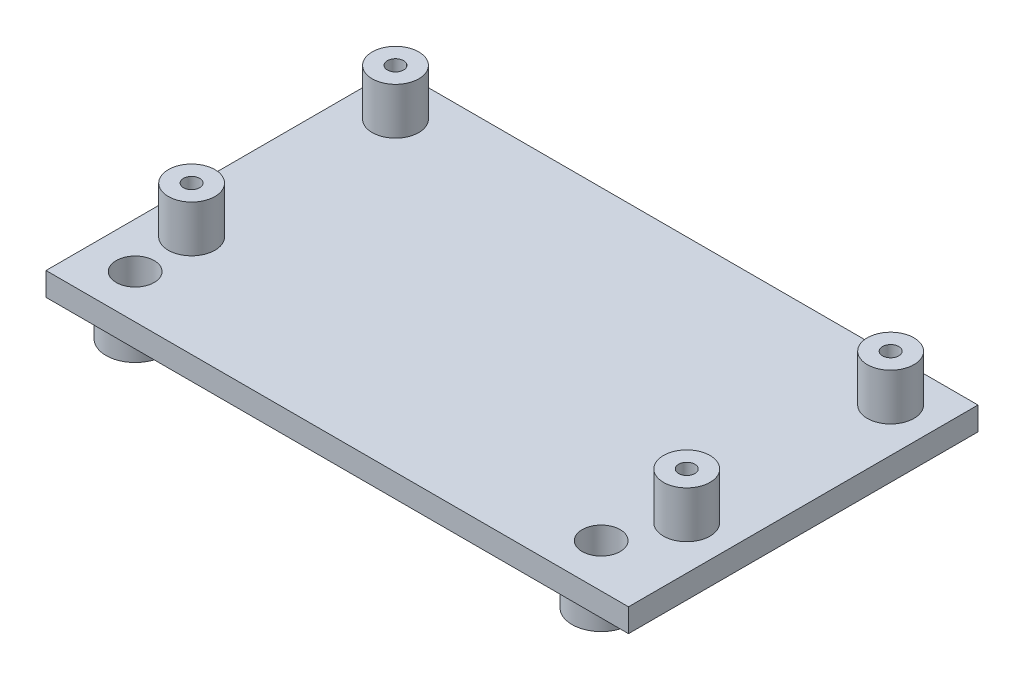
ISO-10303-21;
HEADER;
FILE_DESCRIPTION(('STEP AP214'),'2;1');
FILE_NAME('part.step','',(''),(''),'','','');
FILE_SCHEMA(('AUTOMOTIVE_DESIGN { 1 0 10303 214 1 1 1 1 }'));
ENDSEC;
DATA;
#1=APPLICATION_CONTEXT('core data for automotive mechanical design processes');
#2=APPLICATION_PROTOCOL_DEFINITION('international standard','automotive_design',2000,#1);
#3=PRODUCT_CONTEXT('',#1,'mechanical');
#4=PRODUCT('Part','Part','',(#3));
#5=PRODUCT_RELATED_PRODUCT_CATEGORY('part','',(#4));
#6=PRODUCT_DEFINITION_FORMATION('','',#4);
#7=PRODUCT_DEFINITION_CONTEXT('part definition',#1,'design');
#8=PRODUCT_DEFINITION('design','',#6,#7);
#9=PRODUCT_DEFINITION_SHAPE('','',#8);
#10=(LENGTH_UNIT() NAMED_UNIT(*) SI_UNIT(.MILLI.,.METRE.));
#11=(NAMED_UNIT(*) PLANE_ANGLE_UNIT() SI_UNIT($,.RADIAN.));
#12=(NAMED_UNIT(*) SI_UNIT($,.STERADIAN.) SOLID_ANGLE_UNIT());
#13=UNCERTAINTY_MEASURE_WITH_UNIT(LENGTH_MEASURE(1.E-05),#10,'distance_accuracy_value','');
#14=(GEOMETRIC_REPRESENTATION_CONTEXT(3) GLOBAL_UNCERTAINTY_ASSIGNED_CONTEXT((#13)) GLOBAL_UNIT_ASSIGNED_CONTEXT((#10,
#11,#12)) REPRESENTATION_CONTEXT('',''));
#15=CARTESIAN_POINT('',(0.,0.,0.));
#16=DIRECTION('',(0.,0.,1.));
#17=DIRECTION('',(1.,0.,0.));
#18=AXIS2_PLACEMENT_3D('',#15,#16,#17);
#19=CARTESIAN_POINT('',(3.75,4.,-26.25));
#20=DIRECTION('',(0.,-1.,0.));
#21=DIRECTION('',(0.,0.,-1.));
#22=AXIS2_PLACEMENT_3D('',#19,#20,#21);
#23=CYLINDRICAL_SURFACE('',#22,2.);
#24=CARTESIAN_POINT('',(3.75,4.,-26.25));
#25=DIRECTION('',(0.,1.,0.));
#26=DIRECTION('',(0.,0.,1.));
#27=AXIS2_PLACEMENT_3D('',#24,#25,#26);
#28=CIRCLE('',#27,2.);
#29=CARTESIAN_POINT('',(3.75,4.,-24.25));
#30=VERTEX_POINT('',#29);
#31=EDGE_CURVE('E138',#30,#30,#28,.T.);
#32=ORIENTED_EDGE('',*,*,#31,.F.);
#33=EDGE_LOOP('',(#32));
#34=FACE_BOUND('',#33,.T.);
#35=CARTESIAN_POINT('',(3.75,0.,-26.25));
#36=DIRECTION('',(0.,1.,0.));
#37=DIRECTION('',(0.,0.,1.));
#38=AXIS2_PLACEMENT_3D('',#35,#36,#37);
#39=CIRCLE('',#38,2.);
#40=CARTESIAN_POINT('',(3.75,0.,-24.25));
#41=VERTEX_POINT('',#40);
#42=EDGE_CURVE('E130',#41,#41,#39,.T.);
#43=ORIENTED_EDGE('',*,*,#42,.T.);
#44=EDGE_LOOP('',(#43));
#45=FACE_BOUND('',#44,.T.);
#46=ADVANCED_FACE('F40',(#34,#45),#23,.T.);
#47=CARTESIAN_POINT('',(3.75,4.,-26.25));
#48=DIRECTION('',(0.,1.,0.));
#49=DIRECTION('',(0.,0.,1.));
#50=AXIS2_PLACEMENT_3D('',#47,#48,#49);
#51=PLANE('',#50);
#52=CARTESIAN_POINT('',(3.75,4.,-26.25));
#53=DIRECTION('',(0.,1.,0.));
#54=DIRECTION('',(0.,0.,1.));
#55=AXIS2_PLACEMENT_3D('',#52,#53,#54);
#56=CIRCLE('',#55,0.698499999999987);
#57=CARTESIAN_POINT('',(3.75,4.,-25.5515));
#58=VERTEX_POINT('',#57);
#59=EDGE_CURVE('E458',#58,#58,#56,.T.);
#60=ORIENTED_EDGE('',*,*,#59,.F.);
#61=EDGE_LOOP('',(#60));
#62=FACE_BOUND('',#61,.T.);
#63=ORIENTED_EDGE('',*,*,#31,.T.);
#64=EDGE_LOOP('',(#63));
#65=FACE_BOUND('',#64,.T.);
#66=ADVANCED_FACE('F217',(#62,#65),#51,.T.);
#67=CARTESIAN_POINT('',(0.,-2.,-30.));
#68=DIRECTION('',(-1.,0.,0.));
#69=DIRECTION('',(0.,0.,1.));
#70=AXIS2_PLACEMENT_3D('',#67,#68,#69);
#71=PLANE('',#70);
#72=DIRECTION('',(0.,0.,1.));
#73=VECTOR('',#72,1.);
#74=CARTESIAN_POINT('',(0.,0.,-30.));
#75=LINE('',#74,#73);
#76=CARTESIAN_POINT('',(0.,0.,-30.));
#77=VERTEX_POINT('',#76);
#78=CARTESIAN_POINT('',(0.,0.,0.));
#79=VERTEX_POINT('',#78);
#80=EDGE_CURVE('E115',#77,#79,#75,.T.);
#81=ORIENTED_EDGE('',*,*,#80,.F.);
#82=DIRECTION('',(0.,1.,0.));
#83=VECTOR('',#82,1.);
#84=CARTESIAN_POINT('',(0.,-2.,-30.));
#85=LINE('',#84,#83);
#86=CARTESIAN_POINT('',(0.,-2.,-30.));
#87=VERTEX_POINT('',#86);
#88=EDGE_CURVE('E58',#87,#77,#85,.T.);
#89=ORIENTED_EDGE('',*,*,#88,.F.);
#90=DIRECTION('',(0.,0.,1.));
#91=VECTOR('',#90,1.);
#92=CARTESIAN_POINT('',(0.,-2.,-30.));
#93=LINE('',#92,#91);
#94=CARTESIAN_POINT('',(0.,-2.,0.));
#95=VERTEX_POINT('',#94);
#96=EDGE_CURVE('E106',#87,#95,#93,.T.);
#97=ORIENTED_EDGE('',*,*,#96,.T.);
#98=DIRECTION('',(0.,1.,0.));
#99=VECTOR('',#98,1.);
#100=CARTESIAN_POINT('',(0.,-2.,0.));
#101=LINE('',#100,#99);
#102=EDGE_CURVE('E86',#95,#79,#101,.T.);
#103=ORIENTED_EDGE('',*,*,#102,.T.);
#104=EDGE_LOOP('',(#81,#89,#97,#103));
#105=FACE_BOUND('',#104,.T.);
#106=ADVANCED_FACE('F208',(#105),#71,.T.);
#107=CARTESIAN_POINT('',(0.,-2.,-30.));
#108=DIRECTION('',(0.,0.,-1.));
#109=DIRECTION('',(-1.,0.,0.));
#110=AXIS2_PLACEMENT_3D('',#107,#108,#109);
#111=PLANE('',#110);
#112=DIRECTION('',(-1.,0.,0.));
#113=VECTOR('',#112,1.);
#114=CARTESIAN_POINT('',(0.,0.,-30.));
#115=LINE('',#114,#113);
#116=CARTESIAN_POINT('',(50.,0.,-30.));
#117=VERTEX_POINT('',#116);
#118=EDGE_CURVE('E109',#117,#77,#115,.T.);
#119=ORIENTED_EDGE('',*,*,#118,.F.);
#120=DIRECTION('',(0.,1.,0.));
#121=VECTOR('',#120,1.);
#122=CARTESIAN_POINT('',(50.,-2.,-30.));
#123=LINE('',#122,#121);
#124=CARTESIAN_POINT('',(50.,-2.,-30.));
#125=VERTEX_POINT('',#124);
#126=EDGE_CURVE('E75',#125,#117,#123,.T.);
#127=ORIENTED_EDGE('',*,*,#126,.F.);
#128=DIRECTION('',(-1.,0.,0.));
#129=VECTOR('',#128,1.);
#130=CARTESIAN_POINT('',(0.,-2.,-30.));
#131=LINE('',#130,#129);
#132=EDGE_CURVE('E101',#125,#87,#131,.T.);
#133=ORIENTED_EDGE('',*,*,#132,.T.);
#134=ORIENTED_EDGE('',*,*,#88,.T.);
#135=EDGE_LOOP('',(#119,#127,#133,#134));
#136=FACE_BOUND('',#135,.T.);
#137=ADVANCED_FACE('F209',(#136),#111,.T.);
#138=CARTESIAN_POINT('',(50.,-2.,-30.));
#139=DIRECTION('',(1.,0.,0.));
#140=DIRECTION('',(0.,0.,-1.));
#141=AXIS2_PLACEMENT_3D('',#138,#139,#140);
#142=PLANE('',#141);
#143=DIRECTION('',(0.,0.,-1.));
#144=VECTOR('',#143,1.);
#145=CARTESIAN_POINT('',(50.,0.,-30.));
#146=LINE('',#145,#144);
#147=CARTESIAN_POINT('',(50.,0.,0.));
#148=VERTEX_POINT('',#147);
#149=EDGE_CURVE('E94',#148,#117,#146,.T.);
#150=ORIENTED_EDGE('',*,*,#149,.F.);
#151=DIRECTION('',(0.,1.,0.));
#152=VECTOR('',#151,1.);
#153=CARTESIAN_POINT('',(50.,-2.,0.));
#154=LINE('',#153,#152);
#155=CARTESIAN_POINT('',(50.,-2.,0.));
#156=VERTEX_POINT('',#155);
#157=EDGE_CURVE('E89',#156,#148,#154,.T.);
#158=ORIENTED_EDGE('',*,*,#157,.F.);
#159=DIRECTION('',(0.,0.,-1.));
#160=VECTOR('',#159,1.);
#161=CARTESIAN_POINT('',(50.,-2.,-30.));
#162=LINE('',#161,#160);
#163=EDGE_CURVE('E92',#156,#125,#162,.T.);
#164=ORIENTED_EDGE('',*,*,#163,.T.);
#165=ORIENTED_EDGE('',*,*,#126,.T.);
#166=EDGE_LOOP('',(#150,#158,#164,#165));
#167=FACE_BOUND('',#166,.T.);
#168=ADVANCED_FACE('F91',(#167),#142,.T.);
#169=CARTESIAN_POINT('',(0.,-2.,0.));
#170=DIRECTION('',(0.,0.,1.));
#171=DIRECTION('',(1.,0.,0.));
#172=AXIS2_PLACEMENT_3D('',#169,#170,#171);
#173=PLANE('',#172);
#174=DIRECTION('',(1.,0.,0.));
#175=VECTOR('',#174,1.);
#176=CARTESIAN_POINT('',(0.,0.,0.));
#177=LINE('',#176,#175);
#178=EDGE_CURVE('E119',#79,#148,#177,.T.);
#179=ORIENTED_EDGE('',*,*,#178,.F.);
#180=ORIENTED_EDGE('',*,*,#102,.F.);
#181=DIRECTION('',(1.,0.,0.));
#182=VECTOR('',#181,1.);
#183=CARTESIAN_POINT('',(0.,-2.,0.));
#184=LINE('',#183,#182);
#185=EDGE_CURVE('E100',#95,#156,#184,.T.);
#186=ORIENTED_EDGE('',*,*,#185,.T.);
#187=ORIENTED_EDGE('',*,*,#157,.T.);
#188=EDGE_LOOP('',(#179,#180,#186,#187));
#189=FACE_BOUND('',#188,.T.);
#190=ADVANCED_FACE('F104',(#189),#173,.T.);
#191=CARTESIAN_POINT('',(0.,-2.,0.));
#192=DIRECTION('',(0.,1.,0.));
#193=DIRECTION('',(0.,0.,1.));
#194=AXIS2_PLACEMENT_3D('',#191,#192,#193);
#195=PLANE('',#194);
#196=CARTESIAN_POINT('',(43.905878752839,-2.,-3.75));
#197=DIRECTION('',(0.,1.,0.));
#198=DIRECTION('',(0.,0.,1.));
#199=AXIS2_PLACEMENT_3D('',#196,#197,#198);
#200=CIRCLE('',#199,2.5);
#201=CARTESIAN_POINT('',(43.905878752839,-2.,-1.25));
#202=VERTEX_POINT('',#201);
#203=EDGE_CURVE('E11',#202,#202,#200,.F.);
#204=ORIENTED_EDGE('',*,*,#203,.F.);
#205=EDGE_LOOP('',(#204));
#206=FACE_BOUND('',#205,.T.);
#207=CARTESIAN_POINT('',(3.90587875283896,-2.,-3.75));
#208=DIRECTION('',(0.,1.,0.));
#209=DIRECTION('',(0.,0.,1.));
#210=AXIS2_PLACEMENT_3D('',#207,#208,#209);
#211=CIRCLE('',#210,2.5);
#212=CARTESIAN_POINT('',(3.90587875283896,-2.,-1.25));
#213=VERTEX_POINT('',#212);
#214=EDGE_CURVE('E50',#213,#213,#211,.F.);
#215=ORIENTED_EDGE('',*,*,#214,.F.);
#216=EDGE_LOOP('',(#215));
#217=FACE_BOUND('',#216,.T.);
#218=CARTESIAN_POINT('',(3.75,-2.,-26.25));
#219=DIRECTION('',(0.,1.,0.));
#220=DIRECTION('',(0.,0.,1.));
#221=AXIS2_PLACEMENT_3D('',#218,#219,#220);
#222=CIRCLE('',#221,0.698499999999999);
#223=CARTESIAN_POINT('',(3.75,-2.,-25.5515));
#224=VERTEX_POINT('',#223);
#225=EDGE_CURVE('E156',#224,#224,#222,.T.);
#226=ORIENTED_EDGE('',*,*,#225,.T.);
#227=EDGE_LOOP('',(#226));
#228=FACE_BOUND('',#227,.T.);
#229=CARTESIAN_POINT('',(46.25,-2.,-26.25));
#230=DIRECTION('',(0.,1.,0.));
#231=DIRECTION('',(0.,0.,1.));
#232=AXIS2_PLACEMENT_3D('',#229,#230,#231);
#233=CIRCLE('',#232,0.698499999999998);
#234=CARTESIAN_POINT('',(46.25,-2.,-25.5515));
#235=VERTEX_POINT('',#234);
#236=EDGE_CURVE('E160',#235,#235,#233,.T.);
#237=ORIENTED_EDGE('',*,*,#236,.T.);
#238=EDGE_LOOP('',(#237));
#239=FACE_BOUND('',#238,.T.);
#240=CARTESIAN_POINT('',(46.25,-2.,-8.75));
#241=DIRECTION('',(0.,1.,0.));
#242=DIRECTION('',(0.,0.,1.));
#243=AXIS2_PLACEMENT_3D('',#240,#241,#242);
#244=CIRCLE('',#243,0.698499999999998);
#245=CARTESIAN_POINT('',(46.25,-2.,-8.0515));
#246=VERTEX_POINT('',#245);
#247=EDGE_CURVE('E164',#246,#246,#244,.T.);
#248=ORIENTED_EDGE('',*,*,#247,.T.);
#249=EDGE_LOOP('',(#248));
#250=FACE_BOUND('',#249,.T.);
#251=CARTESIAN_POINT('',(3.75,-2.,-8.75));
#252=DIRECTION('',(0.,1.,0.));
#253=DIRECTION('',(0.,0.,1.));
#254=AXIS2_PLACEMENT_3D('',#251,#252,#253);
#255=CIRCLE('',#254,0.698499999999999);
#256=CARTESIAN_POINT('',(3.75,-2.,-8.0515));
#257=VERTEX_POINT('',#256);
#258=EDGE_CURVE('E167',#257,#257,#255,.T.);
#259=ORIENTED_EDGE('',*,*,#258,.T.);
#260=EDGE_LOOP('',(#259));
#261=FACE_BOUND('',#260,.T.);
#262=ORIENTED_EDGE('',*,*,#96,.F.);
#263=ORIENTED_EDGE('',*,*,#132,.F.);
#264=ORIENTED_EDGE('',*,*,#163,.F.);
#265=ORIENTED_EDGE('',*,*,#185,.F.);
#266=EDGE_LOOP('',(#262,#263,#264,#265));
#267=FACE_BOUND('',#266,.T.);
#268=ADVANCED_FACE('F99',(#206,#217,#228,#239,#250,#261,#267),#195,.F.);
#269=CARTESIAN_POINT('',(0.,0.,0.));
#270=DIRECTION('',(0.,1.,0.));
#271=DIRECTION('',(0.,0.,1.));
#272=AXIS2_PLACEMENT_3D('',#269,#270,#271);
#273=PLANE('',#272);
#274=CARTESIAN_POINT('',(3.90587875283896,0.,-3.75));
#275=DIRECTION('',(0.,1.,0.));
#276=DIRECTION('',(0.,0.,1.));
#277=AXIS2_PLACEMENT_3D('',#274,#275,#276);
#278=CIRCLE('',#277,1.63195);
#279=CARTESIAN_POINT('',(3.90587875283896,0.,-2.11805));
#280=VERTEX_POINT('',#279);
#281=EDGE_CURVE('E43',#280,#280,#278,.T.);
#282=ORIENTED_EDGE('',*,*,#281,.F.);
#283=EDGE_LOOP('',(#282));
#284=FACE_BOUND('',#283,.T.);
#285=CARTESIAN_POINT('',(43.905878752839,0.,-3.75));
#286=DIRECTION('',(0.,1.,0.));
#287=DIRECTION('',(0.,0.,1.));
#288=AXIS2_PLACEMENT_3D('',#285,#286,#287);
#289=CIRCLE('',#288,1.63195);
#290=CARTESIAN_POINT('',(43.905878752839,0.,-2.11805));
#291=VERTEX_POINT('',#290);
#292=EDGE_CURVE('E446',#291,#291,#289,.T.);
#293=ORIENTED_EDGE('',*,*,#292,.F.);
#294=EDGE_LOOP('',(#293));
#295=FACE_BOUND('',#294,.T.);
#296=CARTESIAN_POINT('',(3.75,0.,-8.75));
#297=DIRECTION('',(0.,1.,0.));
#298=DIRECTION('',(0.,0.,1.));
#299=AXIS2_PLACEMENT_3D('',#296,#297,#298);
#300=CIRCLE('',#299,2.);
#301=CARTESIAN_POINT('',(3.75,0.,-6.74999999999999));
#302=VERTEX_POINT('',#301);
#303=EDGE_CURVE('E170',#302,#302,#300,.T.);
#304=ORIENTED_EDGE('',*,*,#303,.F.);
#305=EDGE_LOOP('',(#304));
#306=FACE_BOUND('',#305,.T.);
#307=CARTESIAN_POINT('',(46.25,0.,-8.75));
#308=DIRECTION('',(0.,1.,0.));
#309=DIRECTION('',(0.,0.,1.));
#310=AXIS2_PLACEMENT_3D('',#307,#308,#309);
#311=CIRCLE('',#310,2.);
#312=CARTESIAN_POINT('',(46.25,0.,-6.74999999999999));
#313=VERTEX_POINT('',#312);
#314=EDGE_CURVE('E184',#313,#313,#311,.T.);
#315=ORIENTED_EDGE('',*,*,#314,.F.);
#316=EDGE_LOOP('',(#315));
#317=FACE_BOUND('',#316,.T.);
#318=CARTESIAN_POINT('',(46.25,0.,-26.25));
#319=DIRECTION('',(0.,1.,0.));
#320=DIRECTION('',(0.,0.,1.));
#321=AXIS2_PLACEMENT_3D('',#318,#319,#320);
#322=CIRCLE('',#321,2.);
#323=CARTESIAN_POINT('',(46.25,0.,-24.25));
#324=VERTEX_POINT('',#323);
#325=EDGE_CURVE('E190',#324,#324,#322,.T.);
#326=ORIENTED_EDGE('',*,*,#325,.F.);
#327=EDGE_LOOP('',(#326));
#328=FACE_BOUND('',#327,.T.);
#329=ORIENTED_EDGE('',*,*,#42,.F.);
#330=EDGE_LOOP('',(#329));
#331=FACE_BOUND('',#330,.T.);
#332=ORIENTED_EDGE('',*,*,#80,.T.);
#333=ORIENTED_EDGE('',*,*,#178,.T.);
#334=ORIENTED_EDGE('',*,*,#149,.T.);
#335=ORIENTED_EDGE('',*,*,#118,.T.);
#336=EDGE_LOOP('',(#332,#333,#334,#335));
#337=FACE_BOUND('',#336,.T.);
#338=ADVANCED_FACE('F150',(#284,#295,#306,#317,#328,#331,#337),#273,.T.);
#339=CARTESIAN_POINT('',(46.25,4.,-26.25));
#340=DIRECTION('',(0.,-1.,0.));
#341=DIRECTION('',(0.,0.,-1.));
#342=AXIS2_PLACEMENT_3D('',#339,#340,#341);
#343=CYLINDRICAL_SURFACE('',#342,2.);
#344=CARTESIAN_POINT('',(46.25,4.,-26.25));
#345=DIRECTION('',(0.,1.,0.));
#346=DIRECTION('',(0.,0.,1.));
#347=AXIS2_PLACEMENT_3D('',#344,#345,#346);
#348=CIRCLE('',#347,2.);
#349=CARTESIAN_POINT('',(46.25,4.,-24.25));
#350=VERTEX_POINT('',#349);
#351=EDGE_CURVE('E120',#350,#350,#348,.T.);
#352=ORIENTED_EDGE('',*,*,#351,.F.);
#353=EDGE_LOOP('',(#352));
#354=FACE_BOUND('',#353,.T.);
#355=ORIENTED_EDGE('',*,*,#325,.T.);
#356=EDGE_LOOP('',(#355));
#357=FACE_BOUND('',#356,.T.);
#358=ADVANCED_FACE('F200',(#354,#357),#343,.T.);
#359=CARTESIAN_POINT('',(46.25,4.,-26.25));
#360=DIRECTION('',(0.,1.,0.));
#361=DIRECTION('',(0.,0.,1.));
#362=AXIS2_PLACEMENT_3D('',#359,#360,#361);
#363=PLANE('',#362);
#364=CARTESIAN_POINT('',(46.25,4.,-26.25));
#365=DIRECTION('',(0.,1.,0.));
#366=DIRECTION('',(0.,0.,1.));
#367=AXIS2_PLACEMENT_3D('',#364,#365,#366);
#368=CIRCLE('',#367,0.698499999999984);
#369=CARTESIAN_POINT('',(46.25,4.,-25.5515));
#370=VERTEX_POINT('',#369);
#371=EDGE_CURVE('E464',#370,#370,#368,.T.);
#372=ORIENTED_EDGE('',*,*,#371,.F.);
#373=EDGE_LOOP('',(#372));
#374=FACE_BOUND('',#373,.T.);
#375=ORIENTED_EDGE('',*,*,#351,.T.);
#376=EDGE_LOOP('',(#375));
#377=FACE_BOUND('',#376,.T.);
#378=ADVANCED_FACE('F255',(#374,#377),#363,.T.);
#379=CARTESIAN_POINT('',(46.25,4.,-8.75));
#380=DIRECTION('',(0.,-1.,0.));
#381=DIRECTION('',(0.,0.,-1.));
#382=AXIS2_PLACEMENT_3D('',#379,#380,#381);
#383=CYLINDRICAL_SURFACE('',#382,2.);
#384=CARTESIAN_POINT('',(46.25,4.,-8.75));
#385=DIRECTION('',(0.,1.,0.));
#386=DIRECTION('',(0.,0.,1.));
#387=AXIS2_PLACEMENT_3D('',#384,#385,#386);
#388=CIRCLE('',#387,2.);
#389=CARTESIAN_POINT('',(46.25,4.,-6.74999999999999));
#390=VERTEX_POINT('',#389);
#391=EDGE_CURVE('E186',#390,#390,#388,.T.);
#392=ORIENTED_EDGE('',*,*,#391,.F.);
#393=EDGE_LOOP('',(#392));
#394=FACE_BOUND('',#393,.T.);
#395=ORIENTED_EDGE('',*,*,#314,.T.);
#396=EDGE_LOOP('',(#395));
#397=FACE_BOUND('',#396,.T.);
#398=ADVANCED_FACE('F264',(#394,#397),#383,.T.);
#399=CARTESIAN_POINT('',(46.25,4.,-8.75));
#400=DIRECTION('',(0.,1.,0.));
#401=DIRECTION('',(0.,0.,1.));
#402=AXIS2_PLACEMENT_3D('',#399,#400,#401);
#403=PLANE('',#402);
#404=CARTESIAN_POINT('',(46.25,4.,-8.75));
#405=DIRECTION('',(0.,1.,0.));
#406=DIRECTION('',(0.,0.,1.));
#407=AXIS2_PLACEMENT_3D('',#404,#405,#406);
#408=CIRCLE('',#407,0.698499999999984);
#409=CARTESIAN_POINT('',(46.25,4.,-8.05150000000001));
#410=VERTEX_POINT('',#409);
#411=EDGE_CURVE('E470',#410,#410,#408,.T.);
#412=ORIENTED_EDGE('',*,*,#411,.F.);
#413=EDGE_LOOP('',(#412));
#414=FACE_BOUND('',#413,.T.);
#415=ORIENTED_EDGE('',*,*,#391,.T.);
#416=EDGE_LOOP('',(#415));
#417=FACE_BOUND('',#416,.T.);
#418=ADVANCED_FACE('F272',(#414,#417),#403,.T.);
#419=CARTESIAN_POINT('',(3.75,4.,-8.75));
#420=DIRECTION('',(0.,-1.,0.));
#421=DIRECTION('',(0.,0.,-1.));
#422=AXIS2_PLACEMENT_3D('',#419,#420,#421);
#423=CYLINDRICAL_SURFACE('',#422,2.);
#424=CARTESIAN_POINT('',(3.75,4.,-8.75));
#425=DIRECTION('',(0.,1.,0.));
#426=DIRECTION('',(0.,0.,1.));
#427=AXIS2_PLACEMENT_3D('',#424,#425,#426);
#428=CIRCLE('',#427,2.);
#429=CARTESIAN_POINT('',(3.75,4.,-6.74999999999999));
#430=VERTEX_POINT('',#429);
#431=EDGE_CURVE('E176',#430,#430,#428,.T.);
#432=ORIENTED_EDGE('',*,*,#431,.F.);
#433=EDGE_LOOP('',(#432));
#434=FACE_BOUND('',#433,.T.);
#435=ORIENTED_EDGE('',*,*,#303,.T.);
#436=EDGE_LOOP('',(#435));
#437=FACE_BOUND('',#436,.T.);
#438=ADVANCED_FACE('F280',(#434,#437),#423,.T.);
#439=CARTESIAN_POINT('',(3.75,4.,-8.75));
#440=DIRECTION('',(0.,1.,0.));
#441=DIRECTION('',(0.,0.,1.));
#442=AXIS2_PLACEMENT_3D('',#439,#440,#441);
#443=PLANE('',#442);
#444=CARTESIAN_POINT('',(3.75,4.,-8.75));
#445=DIRECTION('',(0.,1.,0.));
#446=DIRECTION('',(0.,0.,1.));
#447=AXIS2_PLACEMENT_3D('',#444,#445,#446);
#448=CIRCLE('',#447,0.698499999999987);
#449=CARTESIAN_POINT('',(3.75,4.,-8.05150000000001));
#450=VERTEX_POINT('',#449);
#451=EDGE_CURVE('E171',#450,#450,#448,.T.);
#452=ORIENTED_EDGE('',*,*,#451,.F.);
#453=EDGE_LOOP('',(#452));
#454=FACE_BOUND('',#453,.T.);
#455=ORIENTED_EDGE('',*,*,#431,.T.);
#456=EDGE_LOOP('',(#455));
#457=FACE_BOUND('',#456,.T.);
#458=ADVANCED_FACE('F288',(#454,#457),#443,.T.);
#459=CARTESIAN_POINT('',(3.75,4.,-8.75));
#460=DIRECTION('',(0.,1.,0.));
#461=DIRECTION('',(0.,0.,1.));
#462=AXIS2_PLACEMENT_3D('',#459,#460,#461);
#463=CYLINDRICAL_SURFACE('',#462,0.698499999999993);
#464=ORIENTED_EDGE('',*,*,#258,.F.);
#465=EDGE_LOOP('',(#464));
#466=FACE_BOUND('',#465,.T.);
#467=ORIENTED_EDGE('',*,*,#451,.T.);
#468=EDGE_LOOP('',(#467));
#469=FACE_BOUND('',#468,.T.);
#470=ADVANCED_FACE('F295',(#466,#469),#463,.F.);
#471=CARTESIAN_POINT('',(46.25,4.,-8.75));
#472=DIRECTION('',(0.,1.,0.));
#473=DIRECTION('',(0.,0.,1.));
#474=AXIS2_PLACEMENT_3D('',#471,#472,#473);
#475=CYLINDRICAL_SURFACE('',#474,0.698499999999991);
#476=ORIENTED_EDGE('',*,*,#247,.F.);
#477=EDGE_LOOP('',(#476));
#478=FACE_BOUND('',#477,.T.);
#479=ORIENTED_EDGE('',*,*,#411,.T.);
#480=EDGE_LOOP('',(#479));
#481=FACE_BOUND('',#480,.T.);
#482=ADVANCED_FACE('F303',(#478,#481),#475,.F.);
#483=CARTESIAN_POINT('',(46.25,4.,-26.25));
#484=DIRECTION('',(0.,1.,0.));
#485=DIRECTION('',(0.,0.,1.));
#486=AXIS2_PLACEMENT_3D('',#483,#484,#485);
#487=CYLINDRICAL_SURFACE('',#486,0.698499999999991);
#488=ORIENTED_EDGE('',*,*,#236,.F.);
#489=EDGE_LOOP('',(#488));
#490=FACE_BOUND('',#489,.T.);
#491=ORIENTED_EDGE('',*,*,#371,.T.);
#492=EDGE_LOOP('',(#491));
#493=FACE_BOUND('',#492,.T.);
#494=ADVANCED_FACE('F310',(#490,#493),#487,.F.);
#495=CARTESIAN_POINT('',(3.75,4.,-26.25));
#496=DIRECTION('',(0.,1.,0.));
#497=DIRECTION('',(0.,0.,1.));
#498=AXIS2_PLACEMENT_3D('',#495,#496,#497);
#499=CYLINDRICAL_SURFACE('',#498,0.698499999999993);
#500=ORIENTED_EDGE('',*,*,#225,.F.);
#501=EDGE_LOOP('',(#500));
#502=FACE_BOUND('',#501,.T.);
#503=ORIENTED_EDGE('',*,*,#59,.T.);
#504=EDGE_LOOP('',(#503));
#505=FACE_BOUND('',#504,.T.);
#506=ADVANCED_FACE('F318',(#502,#505),#499,.F.);
#507=CARTESIAN_POINT('',(3.90587875283896,-5.,-3.75));
#508=DIRECTION('',(0.,1.,0.));
#509=DIRECTION('',(0.,0.,1.));
#510=AXIS2_PLACEMENT_3D('',#507,#508,#509);
#511=CYLINDRICAL_SURFACE('',#510,2.5);
#512=CARTESIAN_POINT('',(3.90587875283896,-5.,-3.75));
#513=DIRECTION('',(0.,-1.,0.));
#514=DIRECTION('',(0.,0.,-1.));
#515=AXIS2_PLACEMENT_3D('',#512,#513,#514);
#516=CIRCLE('',#515,2.5);
#517=CARTESIAN_POINT('',(3.90587875283896,-5.,-6.25));
#518=VERTEX_POINT('',#517);
#519=EDGE_CURVE('E454',#518,#518,#516,.T.);
#520=ORIENTED_EDGE('',*,*,#519,.F.);
#521=EDGE_LOOP('',(#520));
#522=FACE_BOUND('',#521,.T.);
#523=ORIENTED_EDGE('',*,*,#214,.T.);
#524=EDGE_LOOP('',(#523));
#525=FACE_BOUND('',#524,.T.);
#526=ADVANCED_FACE('F146',(#522,#525),#511,.T.);
#527=CARTESIAN_POINT('',(3.90587875283896,-5.,-3.75));
#528=DIRECTION('',(0.,-1.,0.));
#529=DIRECTION('',(0.,0.,-1.));
#530=AXIS2_PLACEMENT_3D('',#527,#528,#529);
#531=PLANE('',#530);
#532=CARTESIAN_POINT('',(3.90587875283896,-5.,-3.75));
#533=DIRECTION('',(0.,-1.,0.));
#534=DIRECTION('',(0.,0.,-1.));
#535=AXIS2_PLACEMENT_3D('',#532,#533,#534);
#536=CIRCLE('',#535,1.63195);
#537=CARTESIAN_POINT('',(3.90587875283896,-5.,-5.38195));
#538=VERTEX_POINT('',#537);
#539=EDGE_CURVE('E437',#538,#538,#536,.T.);
#540=ORIENTED_EDGE('',*,*,#539,.F.);
#541=EDGE_LOOP('',(#540));
#542=FACE_BOUND('',#541,.T.);
#543=ORIENTED_EDGE('',*,*,#519,.T.);
#544=EDGE_LOOP('',(#543));
#545=FACE_BOUND('',#544,.T.);
#546=ADVANCED_FACE('F331',(#542,#545),#531,.T.);
#547=CARTESIAN_POINT('',(43.905878752839,-5.,-3.75));
#548=DIRECTION('',(0.,1.,0.));
#549=DIRECTION('',(0.,0.,1.));
#550=AXIS2_PLACEMENT_3D('',#547,#548,#549);
#551=CYLINDRICAL_SURFACE('',#550,2.5);
#552=CARTESIAN_POINT('',(43.905878752839,-5.,-3.75));
#553=DIRECTION('',(0.,-1.,0.));
#554=DIRECTION('',(0.,0.,-1.));
#555=AXIS2_PLACEMENT_3D('',#552,#553,#554);
#556=CIRCLE('',#555,2.5);
#557=CARTESIAN_POINT('',(43.905878752839,-5.,-6.25));
#558=VERTEX_POINT('',#557);
#559=EDGE_CURVE('E450',#558,#558,#556,.T.);
#560=ORIENTED_EDGE('',*,*,#559,.F.);
#561=EDGE_LOOP('',(#560));
#562=FACE_BOUND('',#561,.T.);
#563=ORIENTED_EDGE('',*,*,#203,.T.);
#564=EDGE_LOOP('',(#563));
#565=FACE_BOUND('',#564,.T.);
#566=ADVANCED_FACE('F338',(#562,#565),#551,.T.);
#567=CARTESIAN_POINT('',(43.905878752839,-5.,-3.75));
#568=DIRECTION('',(0.,-1.,0.));
#569=DIRECTION('',(0.,0.,-1.));
#570=AXIS2_PLACEMENT_3D('',#567,#568,#569);
#571=PLANE('',#570);
#572=CARTESIAN_POINT('',(43.905878752839,-5.,-3.75));
#573=DIRECTION('',(0.,-1.,0.));
#574=DIRECTION('',(0.,0.,-1.));
#575=AXIS2_PLACEMENT_3D('',#572,#573,#574);
#576=CIRCLE('',#575,1.63195);
#577=CARTESIAN_POINT('',(43.905878752839,-5.,-5.38195));
#578=VERTEX_POINT('',#577);
#579=EDGE_CURVE('E441',#578,#578,#576,.T.);
#580=ORIENTED_EDGE('',*,*,#579,.F.);
#581=EDGE_LOOP('',(#580));
#582=FACE_BOUND('',#581,.T.);
#583=ORIENTED_EDGE('',*,*,#559,.T.);
#584=EDGE_LOOP('',(#583));
#585=FACE_BOUND('',#584,.T.);
#586=ADVANCED_FACE('F346',(#582,#585),#571,.T.);
#587=CARTESIAN_POINT('',(43.905878752839,-5.,-3.75));
#588=DIRECTION('',(0.,-1.,0.));
#589=DIRECTION('',(0.,0.,-1.));
#590=AXIS2_PLACEMENT_3D('',#587,#588,#589);
#591=CYLINDRICAL_SURFACE('',#590,1.63195);
#592=ORIENTED_EDGE('',*,*,#292,.T.);
#593=EDGE_LOOP('',(#592));
#594=FACE_BOUND('',#593,.T.);
#595=ORIENTED_EDGE('',*,*,#579,.T.);
#596=EDGE_LOOP('',(#595));
#597=FACE_BOUND('',#596,.T.);
#598=ADVANCED_FACE('F353',(#594,#597),#591,.F.);
#599=CARTESIAN_POINT('',(3.90587875283896,-5.,-3.75));
#600=DIRECTION('',(0.,-1.,0.));
#601=DIRECTION('',(0.,0.,-1.));
#602=AXIS2_PLACEMENT_3D('',#599,#600,#601);
#603=CYLINDRICAL_SURFACE('',#602,1.63195);
#604=ORIENTED_EDGE('',*,*,#281,.T.);
#605=EDGE_LOOP('',(#604));
#606=FACE_BOUND('',#605,.T.);
#607=ORIENTED_EDGE('',*,*,#539,.T.);
#608=EDGE_LOOP('',(#607));
#609=FACE_BOUND('',#608,.T.);
#610=ADVANCED_FACE('F361',(#606,#609),#603,.F.);
#611=CLOSED_SHELL('',(#46,#66,#106,#137,#168,#190,#268,#338,#358,#378,#398,#418,#438,#458,#470,
#482,#494,#506,#526,#546,#566,#586,#598,#610));
#612=MANIFOLD_SOLID_BREP('B2',#611);
#613=ADVANCED_BREP_SHAPE_REPRESENTATION('',(#18,#612),#14);
#614=SHAPE_DEFINITION_REPRESENTATION(#9,#613);
ENDSEC;
END-ISO-10303-21;
